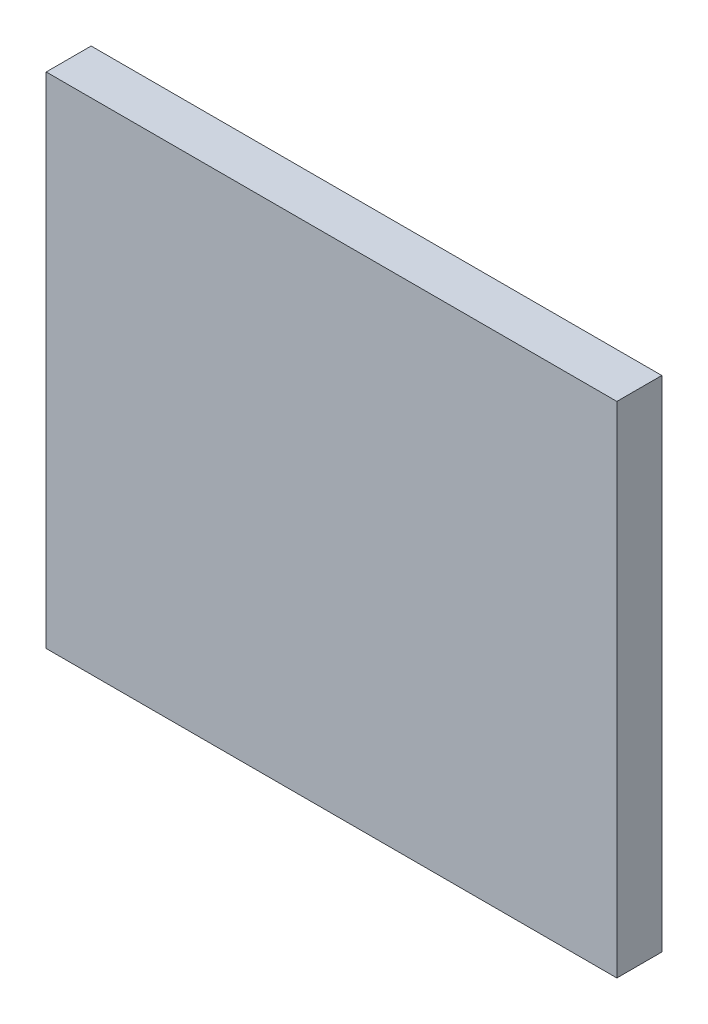
ISO-10303-21;
HEADER;
FILE_DESCRIPTION(('STEP AP214'),'2;1');
FILE_NAME('part.step','',(''),(''),'','','');
FILE_SCHEMA(('AUTOMOTIVE_DESIGN { 1 0 10303 214 1 1 1 1 }'));
ENDSEC;
DATA;
#1=APPLICATION_CONTEXT('core data for automotive mechanical design processes');
#2=APPLICATION_PROTOCOL_DEFINITION('international standard','automotive_design',2000,#1);
#3=PRODUCT_CONTEXT('',#1,'mechanical');
#4=PRODUCT('Part','Part','',(#3));
#5=PRODUCT_RELATED_PRODUCT_CATEGORY('part','',(#4));
#6=PRODUCT_DEFINITION_FORMATION('','',#4);
#7=PRODUCT_DEFINITION_CONTEXT('part definition',#1,'design');
#8=PRODUCT_DEFINITION('design','',#6,#7);
#9=PRODUCT_DEFINITION_SHAPE('','',#8);
#10=(LENGTH_UNIT() NAMED_UNIT(*) SI_UNIT(.MILLI.,.METRE.));
#11=(NAMED_UNIT(*) PLANE_ANGLE_UNIT() SI_UNIT($,.RADIAN.));
#12=(NAMED_UNIT(*) SI_UNIT($,.STERADIAN.) SOLID_ANGLE_UNIT());
#13=UNCERTAINTY_MEASURE_WITH_UNIT(LENGTH_MEASURE(1.E-05),#10,'distance_accuracy_value','');
#14=(GEOMETRIC_REPRESENTATION_CONTEXT(3) GLOBAL_UNCERTAINTY_ASSIGNED_CONTEXT((#13)) GLOBAL_UNIT_ASSIGNED_CONTEXT((#10,
#11,#12)) REPRESENTATION_CONTEXT('',''));
#15=CARTESIAN_POINT('',(0.,0.,0.));
#16=DIRECTION('',(0.,0.,1.));
#17=DIRECTION('',(1.,0.,0.));
#18=AXIS2_PLACEMENT_3D('',#15,#16,#17);
#19=CARTESIAN_POINT('',(10.16,8.89,1.6));
#20=DIRECTION('',(0.,-1.,0.));
#21=DIRECTION('',(0.,0.,-1.));
#22=AXIS2_PLACEMENT_3D('',#19,#20,#21);
#23=PLANE('',#22);
#24=DIRECTION('',(-1.,0.,0.));
#25=VECTOR('',#24,1.);
#26=CARTESIAN_POINT('',(10.16,8.89,0.));
#27=LINE('',#26,#25);
#28=CARTESIAN_POINT('',(10.16,8.89,0.));
#29=VERTEX_POINT('',#28);
#30=CARTESIAN_POINT('',(-10.16,8.89,0.));
#31=VERTEX_POINT('',#30);
#32=EDGE_CURVE('E155',#29,#31,#27,.T.);
#33=ORIENTED_EDGE('',*,*,#32,.T.);
#34=DIRECTION('',(0.,0.,-1.));
#35=VECTOR('',#34,1.);
#36=CARTESIAN_POINT('',(-10.16,8.89,1.6));
#37=LINE('',#36,#35);
#38=CARTESIAN_POINT('',(-10.16,8.89,1.6));
#39=VERTEX_POINT('',#38);
#40=EDGE_CURVE('E11',#39,#31,#37,.T.);
#41=ORIENTED_EDGE('',*,*,#40,.F.);
#42=DIRECTION('',(-1.,0.,0.));
#43=VECTOR('',#42,1.);
#44=CARTESIAN_POINT('',(10.16,8.89,1.6));
#45=LINE('',#44,#43);
#46=CARTESIAN_POINT('',(10.16,8.89,1.6));
#47=VERTEX_POINT('',#46);
#48=EDGE_CURVE('E159',#47,#39,#45,.T.);
#49=ORIENTED_EDGE('',*,*,#48,.F.);
#50=DIRECTION('',(0.,0.,-1.));
#51=VECTOR('',#50,1.);
#52=CARTESIAN_POINT('',(10.16,8.89,1.6));
#53=LINE('',#52,#51);
#54=EDGE_CURVE('E166',#47,#29,#53,.T.);
#55=ORIENTED_EDGE('',*,*,#54,.T.);
#56=EDGE_LOOP('',(#33,#41,#49,#55));
#57=FACE_BOUND('',#56,.T.);
#58=ADVANCED_FACE('F36',(#57),#23,.F.);
#59=CARTESIAN_POINT('',(-10.16,8.89,1.6));
#60=DIRECTION('',(1.,0.,0.));
#61=DIRECTION('',(0.,0.,-1.));
#62=AXIS2_PLACEMENT_3D('',#59,#60,#61);
#63=PLANE('',#62);
#64=DIRECTION('',(0.,-1.,0.));
#65=VECTOR('',#64,1.);
#66=CARTESIAN_POINT('',(-10.16,8.89,0.));
#67=LINE('',#66,#65);
#68=CARTESIAN_POINT('',(-10.16,-8.89,0.));
#69=VERTEX_POINT('',#68);
#70=EDGE_CURVE('E169',#31,#69,#67,.T.);
#71=ORIENTED_EDGE('',*,*,#70,.T.);
#72=DIRECTION('',(0.,0.,-1.));
#73=VECTOR('',#72,1.);
#74=CARTESIAN_POINT('',(-10.16,-8.89,1.6));
#75=LINE('',#74,#73);
#76=CARTESIAN_POINT('',(-10.16,-8.89,1.6));
#77=VERTEX_POINT('',#76);
#78=EDGE_CURVE('E43',#77,#69,#75,.T.);
#79=ORIENTED_EDGE('',*,*,#78,.F.);
#80=DIRECTION('',(0.,-1.,0.));
#81=VECTOR('',#80,1.);
#82=CARTESIAN_POINT('',(-10.16,8.89,1.6));
#83=LINE('',#82,#81);
#84=EDGE_CURVE('E87',#39,#77,#83,.T.);
#85=ORIENTED_EDGE('',*,*,#84,.F.);
#86=ORIENTED_EDGE('',*,*,#40,.T.);
#87=EDGE_LOOP('',(#71,#79,#85,#86));
#88=FACE_BOUND('',#87,.T.);
#89=ADVANCED_FACE('F198',(#88),#63,.F.);
#90=CARTESIAN_POINT('',(-10.16,-8.89,1.6));
#91=DIRECTION('',(0.,1.,0.));
#92=DIRECTION('',(0.,0.,1.));
#93=AXIS2_PLACEMENT_3D('',#90,#91,#92);
#94=PLANE('',#93);
#95=DIRECTION('',(1.,0.,0.));
#96=VECTOR('',#95,1.);
#97=CARTESIAN_POINT('',(-10.16,-8.89,0.));
#98=LINE('',#97,#96);
#99=CARTESIAN_POINT('',(10.16,-8.89,0.));
#100=VERTEX_POINT('',#99);
#101=EDGE_CURVE('E172',#69,#100,#98,.T.);
#102=ORIENTED_EDGE('',*,*,#101,.T.);
#103=DIRECTION('',(0.,0.,-1.));
#104=VECTOR('',#103,1.);
#105=CARTESIAN_POINT('',(10.16,-8.89,1.6));
#106=LINE('',#105,#104);
#107=CARTESIAN_POINT('',(10.16,-8.89,1.6));
#108=VERTEX_POINT('',#107);
#109=EDGE_CURVE('E176',#108,#100,#106,.T.);
#110=ORIENTED_EDGE('',*,*,#109,.F.);
#111=DIRECTION('',(1.,0.,0.));
#112=VECTOR('',#111,1.);
#113=CARTESIAN_POINT('',(-10.16,-8.89,1.6));
#114=LINE('',#113,#112);
#115=EDGE_CURVE('E163',#77,#108,#114,.T.);
#116=ORIENTED_EDGE('',*,*,#115,.F.);
#117=ORIENTED_EDGE('',*,*,#78,.T.);
#118=EDGE_LOOP('',(#102,#110,#116,#117));
#119=FACE_BOUND('',#118,.T.);
#120=ADVANCED_FACE('F181',(#119),#94,.F.);
#121=CARTESIAN_POINT('',(10.16,-8.89,1.6));
#122=DIRECTION('',(-1.,0.,0.));
#123=DIRECTION('',(0.,0.,1.));
#124=AXIS2_PLACEMENT_3D('',#121,#122,#123);
#125=PLANE('',#124);
#126=DIRECTION('',(0.,1.,0.));
#127=VECTOR('',#126,1.);
#128=CARTESIAN_POINT('',(10.16,-8.89,0.));
#129=LINE('',#128,#127);
#130=EDGE_CURVE('E80',#100,#29,#129,.T.);
#131=ORIENTED_EDGE('',*,*,#130,.T.);
#132=ORIENTED_EDGE('',*,*,#54,.F.);
#133=DIRECTION('',(0.,1.,0.));
#134=VECTOR('',#133,1.);
#135=CARTESIAN_POINT('',(10.16,-8.89,1.6));
#136=LINE('',#135,#134);
#137=EDGE_CURVE('E59',#108,#47,#136,.T.);
#138=ORIENTED_EDGE('',*,*,#137,.F.);
#139=ORIENTED_EDGE('',*,*,#109,.T.);
#140=EDGE_LOOP('',(#131,#132,#138,#139));
#141=FACE_BOUND('',#140,.T.);
#142=ADVANCED_FACE('F189',(#141),#125,.F.);
#143=CARTESIAN_POINT('',(0.,0.,1.6));
#144=DIRECTION('',(0.,0.,1.));
#145=DIRECTION('',(1.,0.,0.));
#146=AXIS2_PLACEMENT_3D('',#143,#144,#145);
#147=PLANE('',#146);
#148=ORIENTED_EDGE('',*,*,#48,.T.);
#149=ORIENTED_EDGE('',*,*,#84,.T.);
#150=ORIENTED_EDGE('',*,*,#115,.T.);
#151=ORIENTED_EDGE('',*,*,#137,.T.);
#152=EDGE_LOOP('',(#148,#149,#150,#151));
#153=FACE_BOUND('',#152,.T.);
#154=ADVANCED_FACE('F191',(#153),#147,.T.);
#155=CARTESIAN_POINT('',(0.,0.,0.));
#156=DIRECTION('',(0.,0.,1.));
#157=DIRECTION('',(1.,0.,0.));
#158=AXIS2_PLACEMENT_3D('',#155,#156,#157);
#159=PLANE('',#158);
#160=DIRECTION('',(0.,1.,0.));
#161=VECTOR('',#160,1.);
#162=CARTESIAN_POINT('',(5.2705,3.683,0.));
#163=LINE('',#162,#161);
#164=CARTESIAN_POINT('',(5.2705,-3.683,0.));
#165=VERTEX_POINT('',#164);
#166=CARTESIAN_POINT('',(5.2705,3.683,0.));
#167=VERTEX_POINT('',#166);
#168=EDGE_CURVE('E136',#165,#167,#163,.T.);
#169=ORIENTED_EDGE('',*,*,#168,.T.);
#170=DIRECTION('',(-1.,0.,0.));
#171=VECTOR('',#170,1.);
#172=CARTESIAN_POINT('',(-5.2705,3.683,0.));
#173=LINE('',#172,#171);
#174=CARTESIAN_POINT('',(-5.2705,3.683,0.));
#175=VERTEX_POINT('',#174);
#176=EDGE_CURVE('E147',#167,#175,#173,.T.);
#177=ORIENTED_EDGE('',*,*,#176,.T.);
#178=DIRECTION('',(0.,-1.,0.));
#179=VECTOR('',#178,1.);
#180=CARTESIAN_POINT('',(-5.2705,-3.683,0.));
#181=LINE('',#180,#179);
#182=CARTESIAN_POINT('',(-5.2705,-3.683,0.));
#183=VERTEX_POINT('',#182);
#184=EDGE_CURVE('E114',#175,#183,#181,.T.);
#185=ORIENTED_EDGE('',*,*,#184,.T.);
#186=DIRECTION('',(1.,0.,0.));
#187=VECTOR('',#186,1.);
#188=CARTESIAN_POINT('',(5.2705,-3.683,0.));
#189=LINE('',#188,#187);
#190=EDGE_CURVE('E50',#183,#165,#189,.T.);
#191=ORIENTED_EDGE('',*,*,#190,.T.);
#192=EDGE_LOOP('',(#169,#177,#185,#191));
#193=FACE_BOUND('',#192,.T.);
#194=ORIENTED_EDGE('',*,*,#32,.F.);
#195=ORIENTED_EDGE('',*,*,#130,.F.);
#196=ORIENTED_EDGE('',*,*,#101,.F.);
#197=ORIENTED_EDGE('',*,*,#70,.F.);
#198=EDGE_LOOP('',(#194,#195,#196,#197));
#199=FACE_BOUND('',#198,.T.);
#200=ADVANCED_FACE('F185',(#193,#199),#159,.F.);
#201=CARTESIAN_POINT('',(-5.2705,3.683,-3.556));
#202=DIRECTION('',(0.,1.,0.));
#203=DIRECTION('',(-1.,0.,0.));
#204=AXIS2_PLACEMENT_3D('',#201,#202,#203);
#205=PLANE('',#204);
#206=ORIENTED_EDGE('',*,*,#176,.F.);
#207=DIRECTION('',(0.,0.,1.));
#208=VECTOR('',#207,1.);
#209=CARTESIAN_POINT('',(5.2705,3.683,-3.556));
#210=LINE('',#209,#208);
#211=CARTESIAN_POINT('',(5.2705,3.683,-3.556));
#212=VERTEX_POINT('',#211);
#213=EDGE_CURVE('E134',#212,#167,#210,.T.);
#214=ORIENTED_EDGE('',*,*,#213,.F.);
#215=DIRECTION('',(-1.,0.,0.));
#216=VECTOR('',#215,1.);
#217=CARTESIAN_POINT('',(-5.2705,3.683,-3.556));
#218=LINE('',#217,#216);
#219=CARTESIAN_POINT('',(-5.2705,3.683,-3.556));
#220=VERTEX_POINT('',#219);
#221=EDGE_CURVE('E127',#212,#220,#218,.T.);
#222=ORIENTED_EDGE('',*,*,#221,.T.);
#223=DIRECTION('',(0.,0.,1.));
#224=VECTOR('',#223,1.);
#225=CARTESIAN_POINT('',(-5.2705,3.683,-3.556));
#226=LINE('',#225,#224);
#227=EDGE_CURVE('E109',#220,#175,#226,.T.);
#228=ORIENTED_EDGE('',*,*,#227,.T.);
#229=EDGE_LOOP('',(#206,#214,#222,#228));
#230=FACE_BOUND('',#229,.T.);
#231=ADVANCED_FACE('F133',(#230),#205,.T.);
#232=CARTESIAN_POINT('',(5.2705,3.683,-3.556));
#233=DIRECTION('',(1.,0.,0.));
#234=DIRECTION('',(0.,0.,-1.));
#235=AXIS2_PLACEMENT_3D('',#232,#233,#234);
#236=PLANE('',#235);
#237=ORIENTED_EDGE('',*,*,#168,.F.);
#238=DIRECTION('',(0.,0.,1.));
#239=VECTOR('',#238,1.);
#240=CARTESIAN_POINT('',(5.2705,-3.683,-3.556));
#241=LINE('',#240,#239);
#242=CARTESIAN_POINT('',(5.2705,-3.683,-3.556));
#243=VERTEX_POINT('',#242);
#244=EDGE_CURVE('E156',#243,#165,#241,.T.);
#245=ORIENTED_EDGE('',*,*,#244,.F.);
#246=DIRECTION('',(0.,1.,0.));
#247=VECTOR('',#246,1.);
#248=CARTESIAN_POINT('',(5.2705,3.683,-3.556));
#249=LINE('',#248,#247);
#250=EDGE_CURVE('E120',#243,#212,#249,.T.);
#251=ORIENTED_EDGE('',*,*,#250,.T.);
#252=ORIENTED_EDGE('',*,*,#213,.T.);
#253=EDGE_LOOP('',(#237,#245,#251,#252));
#254=FACE_BOUND('',#253,.T.);
#255=ADVANCED_FACE('F241',(#254),#236,.T.);
#256=CARTESIAN_POINT('',(5.2705,-3.683,-3.556));
#257=DIRECTION('',(0.,-1.,0.));
#258=DIRECTION('',(1.,0.,0.));
#259=AXIS2_PLACEMENT_3D('',#256,#257,#258);
#260=PLANE('',#259);
#261=ORIENTED_EDGE('',*,*,#190,.F.);
#262=DIRECTION('',(0.,0.,1.));
#263=VECTOR('',#262,1.);
#264=CARTESIAN_POINT('',(-5.2705,-3.683,-3.556));
#265=LINE('',#264,#263);
#266=CARTESIAN_POINT('',(-5.2705,-3.683,-3.556));
#267=VERTEX_POINT('',#266);
#268=EDGE_CURVE('E119',#267,#183,#265,.T.);
#269=ORIENTED_EDGE('',*,*,#268,.F.);
#270=DIRECTION('',(1.,0.,0.));
#271=VECTOR('',#270,1.);
#272=CARTESIAN_POINT('',(5.2705,-3.683,-3.556));
#273=LINE('',#272,#271);
#274=EDGE_CURVE('E130',#267,#243,#273,.T.);
#275=ORIENTED_EDGE('',*,*,#274,.T.);
#276=ORIENTED_EDGE('',*,*,#244,.T.);
#277=EDGE_LOOP('',(#261,#269,#275,#276));
#278=FACE_BOUND('',#277,.T.);
#279=ADVANCED_FACE('F234',(#278),#260,.T.);
#280=CARTESIAN_POINT('',(-5.2705,-3.683,-3.556));
#281=DIRECTION('',(-1.,0.,0.));
#282=DIRECTION('',(0.,-1.,0.));
#283=AXIS2_PLACEMENT_3D('',#280,#281,#282);
#284=PLANE('',#283);
#285=ORIENTED_EDGE('',*,*,#184,.F.);
#286=ORIENTED_EDGE('',*,*,#227,.F.);
#287=DIRECTION('',(0.,-1.,0.));
#288=VECTOR('',#287,1.);
#289=CARTESIAN_POINT('',(-5.2705,-3.683,-3.556));
#290=LINE('',#289,#288);
#291=EDGE_CURVE('E112',#220,#267,#290,.T.);
#292=ORIENTED_EDGE('',*,*,#291,.T.);
#293=ORIENTED_EDGE('',*,*,#268,.T.);
#294=EDGE_LOOP('',(#285,#286,#292,#293));
#295=FACE_BOUND('',#294,.T.);
#296=ADVANCED_FACE('F111',(#295),#284,.T.);
#297=CARTESIAN_POINT('',(0.,0.,-3.556));
#298=DIRECTION('',(0.,0.,-1.));
#299=DIRECTION('',(-1.,0.,0.));
#300=AXIS2_PLACEMENT_3D('',#297,#298,#299);
#301=PLANE('',#300);
#302=ORIENTED_EDGE('',*,*,#221,.F.);
#303=ORIENTED_EDGE('',*,*,#250,.F.);
#304=ORIENTED_EDGE('',*,*,#274,.F.);
#305=ORIENTED_EDGE('',*,*,#291,.F.);
#306=EDGE_LOOP('',(#302,#303,#304,#305));
#307=FACE_BOUND('',#306,.T.);
#308=ADVANCED_FACE('F125',(#307),#301,.T.);
#309=CLOSED_SHELL('',(#58,#89,#120,#142,#154,#200,#231,#255,#279,#296,#308));
#310=MANIFOLD_SOLID_BREP('B2',#309);
#311=ADVANCED_BREP_SHAPE_REPRESENTATION('',(#18,#310),#14);
#312=SHAPE_DEFINITION_REPRESENTATION(#9,#311);
ENDSEC;
END-ISO-10303-21;
